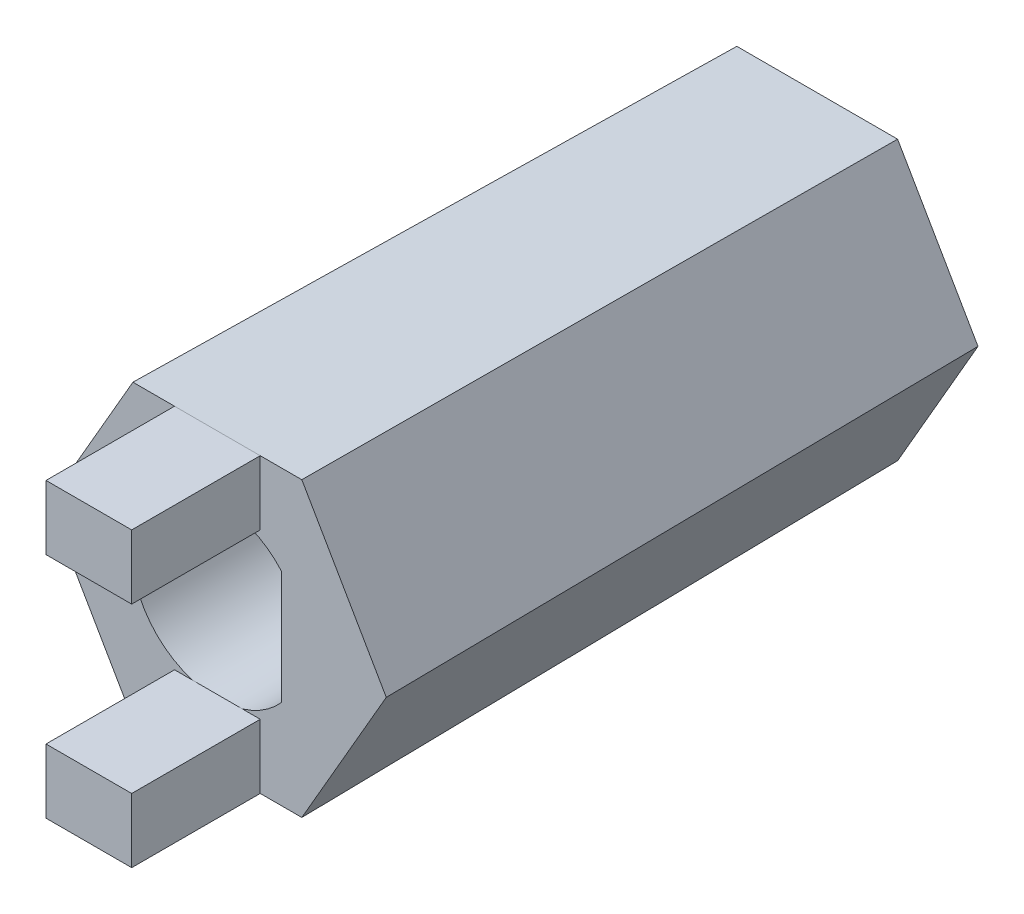
ISO-10303-21;
HEADER;
FILE_DESCRIPTION(('STEP AP214'),'2;1');
FILE_NAME('part.step','',(''),(''),'','','');
FILE_SCHEMA(('AUTOMOTIVE_DESIGN { 1 0 10303 214 1 1 1 1 }'));
ENDSEC;
DATA;
#1=APPLICATION_CONTEXT('core data for automotive mechanical design processes');
#2=APPLICATION_PROTOCOL_DEFINITION('international standard','automotive_design',2000,#1);
#3=PRODUCT_CONTEXT('',#1,'mechanical');
#4=PRODUCT('Part','Part','',(#3));
#5=PRODUCT_RELATED_PRODUCT_CATEGORY('part','',(#4));
#6=PRODUCT_DEFINITION_FORMATION('','',#4);
#7=PRODUCT_DEFINITION_CONTEXT('part definition',#1,'design');
#8=PRODUCT_DEFINITION('design','',#6,#7);
#9=PRODUCT_DEFINITION_SHAPE('','',#8);
#10=(LENGTH_UNIT() NAMED_UNIT(*) SI_UNIT(.MILLI.,.METRE.));
#11=(NAMED_UNIT(*) PLANE_ANGLE_UNIT() SI_UNIT($,.RADIAN.));
#12=(NAMED_UNIT(*) SI_UNIT($,.STERADIAN.) SOLID_ANGLE_UNIT());
#13=UNCERTAINTY_MEASURE_WITH_UNIT(LENGTH_MEASURE(1.E-05),#10,'distance_accuracy_value','');
#14=(GEOMETRIC_REPRESENTATION_CONTEXT(3) GLOBAL_UNCERTAINTY_ASSIGNED_CONTEXT((#13)) GLOBAL_UNIT_ASSIGNED_CONTEXT((#10,
#11,#12)) REPRESENTATION_CONTEXT('',''));
#15=CARTESIAN_POINT('',(0.,0.,0.));
#16=DIRECTION('',(0.,0.,1.));
#17=DIRECTION('',(1.,0.,0.));
#18=AXIS2_PLACEMENT_3D('',#15,#16,#17);
#19=CARTESIAN_POINT('',(0.,0.,14.));
#20=DIRECTION('',(0.,0.,1.));
#21=DIRECTION('',(1.,0.,0.));
#22=AXIS2_PLACEMENT_3D('',#19,#20,#21);
#23=PLANE('',#22);
#24=DIRECTION('',(-1.,0.,0.));
#25=VECTOR('',#24,1.);
#26=CARTESIAN_POINT('',(1.,-1.91371934638351,14.));
#27=LINE('',#26,#25);
#28=CARTESIAN_POINT('',(1.,-1.91371934638351,14.));
#29=VERTEX_POINT('',#28);
#30=CARTESIAN_POINT('',(0.581100906278292,-1.91371934638351,14.));
#31=VERTEX_POINT('',#30);
#32=EDGE_CURVE('E54',#29,#31,#27,.T.);
#33=ORIENTED_EDGE('',*,*,#32,.F.);
#34=DIRECTION('',(0.,1.,0.));
#35=VECTOR('',#34,1.);
#36=CARTESIAN_POINT('',(1.,-1.91371934638351,14.));
#37=LINE('',#36,#35);
#38=CARTESIAN_POINT('',(1.,-3.41371934638351,14.));
#39=VERTEX_POINT('',#38);
#40=EDGE_CURVE('E186',#39,#29,#37,.T.);
#41=ORIENTED_EDGE('',*,*,#40,.F.);
#42=DIRECTION('',(-1.,0.,0.));
#43=VECTOR('',#42,1.);
#44=CARTESIAN_POINT('',(-1.87638837486628,-3.41371934638352,14.));
#45=LINE('',#44,#43);
#46=CARTESIAN_POINT('',(1.97091178357236,-3.41371934638351,14.));
#47=VERTEX_POINT('',#46);
#48=EDGE_CURVE('E334',#39,#47,#45,.F.);
#49=ORIENTED_EDGE('',*,*,#48,.T.);
#50=DIRECTION('',(-0.5,-0.866025403784439,0.));
#51=VECTOR('',#50,1.);
#52=CARTESIAN_POINT('',(2.01817348792539,-3.33185967319176,14.));
#53=LINE('',#52,#51);
#54=CARTESIAN_POINT('',(3.94182356714471,0.,14.));
#55=VERTEX_POINT('',#54);
#56=EDGE_CURVE('E39',#47,#55,#53,.F.);
#57=ORIENTED_EDGE('',*,*,#56,.T.);
#58=DIRECTION('',(0.5,-0.866025403784438,0.));
#59=VECTOR('',#58,1.);
#60=CARTESIAN_POINT('',(3.89456186279168,0.081859673191758,14.));
#61=LINE('',#60,#59);
#62=CARTESIAN_POINT('',(1.97091178357236,3.41371934638351,14.));
#63=VERTEX_POINT('',#62);
#64=EDGE_CURVE('E315',#55,#63,#61,.F.);
#65=ORIENTED_EDGE('',*,*,#64,.T.);
#66=DIRECTION('',(1.,0.,0.));
#67=VECTOR('',#66,1.);
#68=CARTESIAN_POINT('',(1.87638837486628,3.41371934638351,14.));
#69=LINE('',#68,#67);
#70=CARTESIAN_POINT('',(1.,3.41371934638351,14.));
#71=VERTEX_POINT('',#70);
#72=EDGE_CURVE('E329',#63,#71,#69,.F.);
#73=ORIENTED_EDGE('',*,*,#72,.T.);
#74=DIRECTION('',(0.,1.,0.));
#75=VECTOR('',#74,1.);
#76=CARTESIAN_POINT('',(1.,1.91371934638351,14.));
#77=LINE('',#76,#75);
#78=CARTESIAN_POINT('',(1.,1.91371934638351,14.));
#79=VERTEX_POINT('',#78);
#80=EDGE_CURVE('E206',#79,#71,#77,.T.);
#81=ORIENTED_EDGE('',*,*,#80,.F.);
#82=DIRECTION('',(1.,0.,0.));
#83=VECTOR('',#82,1.);
#84=CARTESIAN_POINT('',(1.,1.91371934638351,14.));
#85=LINE('',#84,#83);
#86=CARTESIAN_POINT('',(0.581100906278292,1.91371934638351,14.));
#87=VERTEX_POINT('',#86);
#88=EDGE_CURVE('E11',#87,#79,#85,.T.);
#89=ORIENTED_EDGE('',*,*,#88,.F.);
#90=CARTESIAN_POINT('',(0.,0.,14.));
#91=DIRECTION('',(0.,0.,1.));
#92=DIRECTION('',(1.,0.,0.));
#93=AXIS2_PLACEMENT_3D('',#90,#91,#92);
#94=CIRCLE('',#93,2.);
#95=CARTESIAN_POINT('',(1.5,1.3228756555323,14.));
#96=VERTEX_POINT('',#95);
#97=EDGE_CURVE('E225',#96,#87,#94,.T.);
#98=ORIENTED_EDGE('',*,*,#97,.F.);
#99=DIRECTION('',(0.,-1.,0.));
#100=VECTOR('',#99,1.);
#101=CARTESIAN_POINT('',(1.5,0.,14.));
#102=LINE('',#101,#100);
#103=CARTESIAN_POINT('',(1.5,-1.3228756555323,14.));
#104=VERTEX_POINT('',#103);
#105=EDGE_CURVE('E221',#96,#104,#102,.T.);
#106=ORIENTED_EDGE('',*,*,#105,.T.);
#107=EDGE_CURVE('E224',#31,#104,#94,.T.);
#108=ORIENTED_EDGE('',*,*,#107,.F.);
#109=EDGE_LOOP('',(#33,#41,#49,#57,#65,#73,#81,#89,#98,#106,#108));
#110=FACE_BOUND('',#109,.T.);
#111=ADVANCED_FACE('F35',(#110),#23,.T.);
#112=DIRECTION('',(0.,-1.,0.));
#113=VECTOR('',#112,1.);
#114=CARTESIAN_POINT('',(-1.,-1.91371934638351,14.));
#115=LINE('',#114,#113);
#116=CARTESIAN_POINT('',(-1.,-1.91371934638351,14.));
#117=VERTEX_POINT('',#116);
#118=CARTESIAN_POINT('',(-1.,-3.41371934638351,14.));
#119=VERTEX_POINT('',#118);
#120=EDGE_CURVE('E566',#117,#119,#115,.T.);
#121=ORIENTED_EDGE('',*,*,#120,.F.);
#122=CARTESIAN_POINT('',(-0.581100906278293,-1.91371934638351,14.));
#123=VERTEX_POINT('',#122);
#124=EDGE_CURVE('E564',#123,#117,#27,.T.);
#125=ORIENTED_EDGE('',*,*,#124,.F.);
#126=CARTESIAN_POINT('',(-0.581100906278293,1.91371934638351,14.));
#127=VERTEX_POINT('',#126);
#128=EDGE_CURVE('E372',#127,#123,#94,.T.);
#129=ORIENTED_EDGE('',*,*,#128,.F.);
#130=CARTESIAN_POINT('',(-1.,1.91371934638351,14.));
#131=VERTEX_POINT('',#130);
#132=EDGE_CURVE('E46',#131,#127,#85,.T.);
#133=ORIENTED_EDGE('',*,*,#132,.F.);
#134=DIRECTION('',(0.,-1.,0.));
#135=VECTOR('',#134,1.);
#136=CARTESIAN_POINT('',(-1.,1.91371934638351,14.));
#137=LINE('',#136,#135);
#138=CARTESIAN_POINT('',(-0.999999999999999,3.41371934638351,14.));
#139=VERTEX_POINT('',#138);
#140=EDGE_CURVE('E187',#139,#131,#137,.T.);
#141=ORIENTED_EDGE('',*,*,#140,.F.);
#142=CARTESIAN_POINT('',(-1.97091178357236,3.41371934638351,14.));
#143=VERTEX_POINT('',#142);
#144=EDGE_CURVE('E328',#139,#143,#69,.F.);
#145=ORIENTED_EDGE('',*,*,#144,.T.);
#146=DIRECTION('',(0.5,0.866025403784439,0.));
#147=VECTOR('',#146,1.);
#148=CARTESIAN_POINT('',(-2.01817348792539,3.33185967319176,14.));
#149=LINE('',#148,#147);
#150=CARTESIAN_POINT('',(-3.94182356714471,0.,14.));
#151=VERTEX_POINT('',#150);
#152=EDGE_CURVE('E332',#143,#151,#149,.F.);
#153=ORIENTED_EDGE('',*,*,#152,.T.);
#154=DIRECTION('',(-0.5,0.866025403784438,0.));
#155=VECTOR('',#154,1.);
#156=CARTESIAN_POINT('',(-3.89456186279167,-0.0818596731917588,14.));
#157=LINE('',#156,#155);
#158=CARTESIAN_POINT('',(-1.97091178357235,-3.41371934638352,14.));
#159=VERTEX_POINT('',#158);
#160=EDGE_CURVE('E302',#151,#159,#157,.F.);
#161=ORIENTED_EDGE('',*,*,#160,.T.);
#162=EDGE_CURVE('E335',#159,#119,#45,.F.);
#163=ORIENTED_EDGE('',*,*,#162,.T.);
#164=EDGE_LOOP('',(#121,#125,#129,#133,#141,#145,#153,#161,#163));
#165=FACE_BOUND('',#164,.T.);
#166=ADVANCED_FACE('F258',(#165),#23,.T.);
#167=CARTESIAN_POINT('',(3.75277674973257,0.,0.));
#168=DIRECTION('',(0.865966193107302,0.499965814699617,-0.0116934394852461));
#169=DIRECTION('',(-0.5,0.866025403784438,0.));
#170=AXIS2_PLACEMENT_3D('',#167,#168,#169);
#171=PLANE('',#170);
#172=DIRECTION('',(-0.5,0.866025403784438,0.));
#173=VECTOR('',#172,1.);
#174=CARTESIAN_POINT('',(3.75277674973257,0.,0.));
#175=LINE('',#174,#173);
#176=CARTESIAN_POINT('',(3.75277674973257,0.,0.));
#177=VERTEX_POINT('',#176);
#178=CARTESIAN_POINT('',(1.87638837486628,3.25,0.));
#179=VERTEX_POINT('',#178);
#180=EDGE_CURVE('E239',#177,#179,#175,.T.);
#181=ORIENTED_EDGE('',*,*,#180,.T.);
#182=DIRECTION('',(-0.00675105658364069,-0.011693173007638,-0.999908842315147));
#183=VECTOR('',#182,1.);
#184=CARTESIAN_POINT('',(1.87638837486628,3.25,0.));
#185=LINE('',#184,#183);
#186=EDGE_CURVE('E44',#63,#179,#185,.T.);
#187=ORIENTED_EDGE('',*,*,#186,.F.);
#188=ORIENTED_EDGE('',*,*,#64,.F.);
#189=DIRECTION('',(-0.0135021131672814,0.,-0.999908842315147));
#190=VECTOR('',#189,1.);
#191=CARTESIAN_POINT('',(3.75277674973257,0.,0.));
#192=LINE('',#191,#190);
#193=EDGE_CURVE('E318',#55,#177,#192,.T.);
#194=ORIENTED_EDGE('',*,*,#193,.T.);
#195=EDGE_LOOP('',(#181,#187,#188,#194));
#196=FACE_BOUND('',#195,.T.);
#197=ADVANCED_FACE('F265',(#196),#171,.T.);
#198=CARTESIAN_POINT('',(1.87638837486628,3.25,0.));
#199=DIRECTION('',(0.,0.999931629399233,-0.0116934394852461));
#200=DIRECTION('',(0.,0.0116934394852461,0.999931629399233));
#201=AXIS2_PLACEMENT_3D('',#198,#199,#200);
#202=PLANE('',#201);
#203=DIRECTION('',(-1.,0.,0.));
#204=VECTOR('',#203,1.);
#205=CARTESIAN_POINT('',(1.87638837486628,3.25,0.));
#206=LINE('',#205,#204);
#207=CARTESIAN_POINT('',(-1.87638837486628,3.25,0.));
#208=VERTEX_POINT('',#207);
#209=EDGE_CURVE('E298',#179,#208,#206,.T.);
#210=ORIENTED_EDGE('',*,*,#209,.T.);
#211=DIRECTION('',(0.0067510565836407,-0.011693173007638,-0.999908842315147));
#212=VECTOR('',#211,1.);
#213=CARTESIAN_POINT('',(-1.87638837486628,3.25,0.));
#214=LINE('',#213,#212);
#215=EDGE_CURVE('E295',#143,#208,#214,.T.);
#216=ORIENTED_EDGE('',*,*,#215,.F.);
#217=ORIENTED_EDGE('',*,*,#144,.F.);
#218=DIRECTION('',(-1.,0.,0.));
#219=VECTOR('',#218,1.);
#220=CARTESIAN_POINT('',(1.,3.41371934638351,14.));
#221=LINE('',#220,#219);
#222=EDGE_CURVE('E199',#71,#139,#221,.T.);
#223=ORIENTED_EDGE('',*,*,#222,.F.);
#224=ORIENTED_EDGE('',*,*,#72,.F.);
#225=ORIENTED_EDGE('',*,*,#186,.T.);
#226=EDGE_LOOP('',(#210,#216,#217,#223,#224,#225));
#227=FACE_BOUND('',#226,.T.);
#228=ADVANCED_FACE('F37',(#227),#202,.T.);
#229=CARTESIAN_POINT('',(-1.87638837486628,3.25,0.));
#230=DIRECTION('',(-0.865966193107303,0.499965814699616,-0.0116934394852461));
#231=DIRECTION('',(-0.5,-0.866025403784439,0.));
#232=AXIS2_PLACEMENT_3D('',#229,#230,#231);
#233=PLANE('',#232);
#234=DIRECTION('',(-0.5,-0.866025403784439,0.));
#235=VECTOR('',#234,1.);
#236=CARTESIAN_POINT('',(-1.87638837486628,3.25,0.));
#237=LINE('',#236,#235);
#238=CARTESIAN_POINT('',(-3.75277674973257,0.,0.));
#239=VERTEX_POINT('',#238);
#240=EDGE_CURVE('E289',#208,#239,#237,.T.);
#241=ORIENTED_EDGE('',*,*,#240,.T.);
#242=DIRECTION('',(0.0135021131672814,0.,-0.999908842315147));
#243=VECTOR('',#242,1.);
#244=CARTESIAN_POINT('',(-3.75277674973257,0.,0.));
#245=LINE('',#244,#243);
#246=EDGE_CURVE('E292',#151,#239,#245,.T.);
#247=ORIENTED_EDGE('',*,*,#246,.F.);
#248=ORIENTED_EDGE('',*,*,#152,.F.);
#249=ORIENTED_EDGE('',*,*,#215,.T.);
#250=EDGE_LOOP('',(#241,#247,#248,#249));
#251=FACE_BOUND('',#250,.T.);
#252=ADVANCED_FACE('F278',(#251),#233,.T.);
#253=CARTESIAN_POINT('',(-3.75277674973257,0.,0.));
#254=DIRECTION('',(-0.865966193107302,-0.499965814699617,-0.0116934394852461));
#255=DIRECTION('',(0.5,-0.866025403784438,0.));
#256=AXIS2_PLACEMENT_3D('',#253,#254,#255);
#257=PLANE('',#256);
#258=DIRECTION('',(0.5,-0.866025403784439,0.));
#259=VECTOR('',#258,1.);
#260=CARTESIAN_POINT('',(-3.75277674973257,0.,0.));
#261=LINE('',#260,#259);
#262=CARTESIAN_POINT('',(-1.87638837486628,-3.25,0.));
#263=VERTEX_POINT('',#262);
#264=EDGE_CURVE('E297',#239,#263,#261,.T.);
#265=ORIENTED_EDGE('',*,*,#264,.T.);
#266=DIRECTION('',(0.00675105658364069,0.0116931730076381,-0.999908842315147));
#267=VECTOR('',#266,1.);
#268=CARTESIAN_POINT('',(-1.87638837486628,-3.25,0.));
#269=LINE('',#268,#267);
#270=EDGE_CURVE('E303',#159,#263,#269,.T.);
#271=ORIENTED_EDGE('',*,*,#270,.F.);
#272=ORIENTED_EDGE('',*,*,#160,.F.);
#273=ORIENTED_EDGE('',*,*,#246,.T.);
#274=EDGE_LOOP('',(#265,#271,#272,#273));
#275=FACE_BOUND('',#274,.T.);
#276=ADVANCED_FACE('F275',(#275),#257,.T.);
#277=CARTESIAN_POINT('',(-1.87638837486628,-3.25,0.));
#278=DIRECTION('',(0.,-0.999931629399233,-0.0116934394852461));
#279=DIRECTION('',(0.,0.0116934394852461,-0.999931629399233));
#280=AXIS2_PLACEMENT_3D('',#277,#278,#279);
#281=PLANE('',#280);
#282=DIRECTION('',(1.,0.,0.));
#283=VECTOR('',#282,1.);
#284=CARTESIAN_POINT('',(-1.87638837486628,-3.25,0.));
#285=LINE('',#284,#283);
#286=CARTESIAN_POINT('',(1.87638837486629,-3.25,0.));
#287=VERTEX_POINT('',#286);
#288=EDGE_CURVE('E308',#263,#287,#285,.T.);
#289=ORIENTED_EDGE('',*,*,#288,.T.);
#290=DIRECTION('',(-0.00675105658364069,0.011693173007638,-0.999908842315147));
#291=VECTOR('',#290,1.);
#292=CARTESIAN_POINT('',(1.87638837486629,-3.25,0.));
#293=LINE('',#292,#291);
#294=EDGE_CURVE('E321',#47,#287,#293,.T.);
#295=ORIENTED_EDGE('',*,*,#294,.F.);
#296=ORIENTED_EDGE('',*,*,#48,.F.);
#297=DIRECTION('',(1.,0.,0.));
#298=VECTOR('',#297,1.);
#299=CARTESIAN_POINT('',(1.,-3.41371934638351,14.));
#300=LINE('',#299,#298);
#301=EDGE_CURVE('E182',#119,#39,#300,.T.);
#302=ORIENTED_EDGE('',*,*,#301,.F.);
#303=ORIENTED_EDGE('',*,*,#162,.F.);
#304=ORIENTED_EDGE('',*,*,#270,.T.);
#305=EDGE_LOOP('',(#289,#295,#296,#302,#303,#304));
#306=FACE_BOUND('',#305,.T.);
#307=ADVANCED_FACE('F271',(#306),#281,.T.);
#308=CARTESIAN_POINT('',(1.87638837486629,-3.25,0.));
#309=DIRECTION('',(0.865966193107303,-0.499965814699616,-0.0116934394852461));
#310=DIRECTION('',(0.5,0.866025403784439,0.));
#311=AXIS2_PLACEMENT_3D('',#308,#309,#310);
#312=PLANE('',#311);
#313=DIRECTION('',(0.5,0.866025403784439,0.));
#314=VECTOR('',#313,1.);
#315=CARTESIAN_POINT('',(1.87638837486629,-3.25,0.));
#316=LINE('',#315,#314);
#317=EDGE_CURVE('E310',#287,#177,#316,.T.);
#318=ORIENTED_EDGE('',*,*,#317,.T.);
#319=ORIENTED_EDGE('',*,*,#193,.F.);
#320=ORIENTED_EDGE('',*,*,#56,.F.);
#321=ORIENTED_EDGE('',*,*,#294,.T.);
#322=EDGE_LOOP('',(#318,#319,#320,#321));
#323=FACE_BOUND('',#322,.T.);
#324=ADVANCED_FACE('F263',(#323),#312,.T.);
#325=CARTESIAN_POINT('',(0.,0.,0.));
#326=DIRECTION('',(0.,0.,1.));
#327=DIRECTION('',(1.,0.,0.));
#328=AXIS2_PLACEMENT_3D('',#325,#326,#327);
#329=PLANE('',#328);
#330=ORIENTED_EDGE('',*,*,#180,.F.);
#331=ORIENTED_EDGE('',*,*,#317,.F.);
#332=ORIENTED_EDGE('',*,*,#288,.F.);
#333=ORIENTED_EDGE('',*,*,#264,.F.);
#334=ORIENTED_EDGE('',*,*,#240,.F.);
#335=ORIENTED_EDGE('',*,*,#209,.F.);
#336=EDGE_LOOP('',(#330,#331,#332,#333,#334,#335));
#337=FACE_BOUND('',#336,.T.);
#338=ADVANCED_FACE('F260',(#337),#329,.F.);
#339=CARTESIAN_POINT('',(1.5,0.,14.));
#340=DIRECTION('',(0.999931629399233,0.,-0.0116934394852461));
#341=DIRECTION('',(-0.0116934394852461,0.,-0.999931629399233));
#342=AXIS2_PLACEMENT_3D('',#339,#340,#341);
#343=PLANE('',#342);
#344=ORIENTED_EDGE('',*,*,#105,.F.);
#345=CARTESIAN_POINT('',(1.41814032680824,1.29156506874731,7.));
#346=CARTESIAN_POINT('',(1.43292044843653,1.29728596567894,8.26388058202507));
#347=CARTESIAN_POINT('',(1.44770057197983,1.3029702286564,9.52776132780759));
#348=CARTESIAN_POINT('',(1.47498713025429,1.31339668673287,11.8610947076487));
#349=CARTESIAN_POINT('',(1.48749356444157,1.31814928601708,12.9305472951995));
#350=CARTESIAN_POINT('',(1.5,1.3228756555323,14.));
#351=B_SPLINE_CURVE_WITH_KNOTS('',3,(#345,#346,#347,#348,#349,#350),.UNSPECIFIED.,.F.,.F.,(4,2,
4),(0.,3.79193983629961,7.00054864948276),.UNSPECIFIED.);
#352=CARTESIAN_POINT('',(1.41814032680824,1.29156506874731,7.));
#353=VERTEX_POINT('',#352);
#354=EDGE_CURVE('E240',#353,#96,#351,.T.);
#355=ORIENTED_EDGE('',*,*,#354,.F.);
#356=DIRECTION('',(0.,1.,0.));
#357=VECTOR('',#356,1.);
#358=CARTESIAN_POINT('',(1.41814032680824,0.,7.));
#359=LINE('',#358,#357);
#360=CARTESIAN_POINT('',(1.41814032680824,-1.29156506874731,7.));
#361=VERTEX_POINT('',#360);
#362=EDGE_CURVE('E228',#353,#361,#359,.F.);
#363=ORIENTED_EDGE('',*,*,#362,.T.);
#364=CARTESIAN_POINT('',(1.41814032680824,-1.29156506874731,7.));
#365=CARTESIAN_POINT('',(1.43292044843653,-1.29728596567894,8.26388058202507));
#366=CARTESIAN_POINT('',(1.44770057197983,-1.3029702286564,9.52776132780759));
#367=CARTESIAN_POINT('',(1.47498713025429,-1.31339668673287,11.8610947076487));
#368=CARTESIAN_POINT('',(1.48749356444157,-1.31814928601708,12.9305472951995));
#369=CARTESIAN_POINT('',(1.5,-1.3228756555323,14.));
#370=B_SPLINE_CURVE_WITH_KNOTS('',3,(#364,#365,#366,#367,#368,#369),.UNSPECIFIED.,.F.,.F.,(4,2,
4),(0.,3.79193983629961,7.00054864948276),.UNSPECIFIED.);
#371=EDGE_CURVE('E230',#361,#104,#370,.T.);
#372=ORIENTED_EDGE('',*,*,#371,.T.);
#373=EDGE_LOOP('',(#344,#355,#363,#372));
#374=FACE_BOUND('',#373,.T.);
#375=ADVANCED_FACE('F246',(#374),#343,.F.);
#376=CARTESIAN_POINT('',(0.,0.,14.));
#377=DIRECTION('',(0.,0.,1.));
#378=DIRECTION('',(1.,0.,0.));
#379=AXIS2_PLACEMENT_3D('',#376,#377,#378);
#380=CONICAL_SURFACE('',#379,2.,0.011693705988362);
#381=ORIENTED_EDGE('',*,*,#97,.T.);
#382=EDGE_CURVE('E229',#87,#127,#94,.T.);
#383=ORIENTED_EDGE('',*,*,#382,.T.);
#384=ORIENTED_EDGE('',*,*,#128,.T.);
#385=EDGE_CURVE('E373',#123,#31,#94,.T.);
#386=ORIENTED_EDGE('',*,*,#385,.T.);
#387=ORIENTED_EDGE('',*,*,#107,.T.);
#388=ORIENTED_EDGE('',*,*,#371,.F.);
#389=CARTESIAN_POINT('',(0.,0.,7.));
#390=DIRECTION('',(0.,0.,1.));
#391=DIRECTION('',(1.,0.,0.));
#392=AXIS2_PLACEMENT_3D('',#389,#390,#391);
#393=CIRCLE('',#392,1.91814032680824);
#394=EDGE_CURVE('E381',#353,#361,#393,.T.);
#395=ORIENTED_EDGE('',*,*,#394,.F.);
#396=ORIENTED_EDGE('',*,*,#354,.T.);
#397=EDGE_LOOP('',(#381,#383,#384,#386,#387,#388,#395,#396));
#398=FACE_BOUND('',#397,.T.);
#399=ADVANCED_FACE('F249',(#398),#380,.F.);
#400=CARTESIAN_POINT('',(0.,0.,7.));
#401=DIRECTION('',(0.,0.,1.));
#402=DIRECTION('',(1.,0.,0.));
#403=AXIS2_PLACEMENT_3D('',#400,#401,#402);
#404=PLANE('',#403);
#405=ORIENTED_EDGE('',*,*,#362,.F.);
#406=ORIENTED_EDGE('',*,*,#394,.T.);
#407=EDGE_LOOP('',(#405,#406));
#408=FACE_BOUND('',#407,.T.);
#409=ADVANCED_FACE('F253',(#408),#404,.T.);
#410=CARTESIAN_POINT('',(-1.,1.91371934638351,17.));
#411=DIRECTION('',(1.,0.,0.));
#412=DIRECTION('',(0.,0.,-1.));
#413=AXIS2_PLACEMENT_3D('',#410,#411,#412);
#414=PLANE('',#413);
#415=ORIENTED_EDGE('',*,*,#140,.T.);
#416=DIRECTION('',(0.,0.,-1.));
#417=VECTOR('',#416,1.);
#418=CARTESIAN_POINT('',(-1.,1.91371934638351,17.));
#419=LINE('',#418,#417);
#420=CARTESIAN_POINT('',(-1.,1.91371934638351,17.));
#421=VERTEX_POINT('',#420);
#422=EDGE_CURVE('E219',#421,#131,#419,.T.);
#423=ORIENTED_EDGE('',*,*,#422,.F.);
#424=DIRECTION('',(0.,-1.,0.));
#425=VECTOR('',#424,1.);
#426=CARTESIAN_POINT('',(-1.,1.91371934638351,17.));
#427=LINE('',#426,#425);
#428=CARTESIAN_POINT('',(-1.,3.41371934638351,17.));
#429=VERTEX_POINT('',#428);
#430=EDGE_CURVE('E195',#429,#421,#427,.T.);
#431=ORIENTED_EDGE('',*,*,#430,.F.);
#432=DIRECTION('',(0.,0.,-1.));
#433=VECTOR('',#432,1.);
#434=CARTESIAN_POINT('',(-1.,3.41371934638351,17.));
#435=LINE('',#434,#433);
#436=EDGE_CURVE('E204',#429,#139,#435,.T.);
#437=ORIENTED_EDGE('',*,*,#436,.T.);
#438=EDGE_LOOP('',(#415,#423,#431,#437));
#439=FACE_BOUND('',#438,.T.);
#440=ADVANCED_FACE('F386',(#439),#414,.F.);
#441=CARTESIAN_POINT('',(1.,1.91371934638351,17.));
#442=DIRECTION('',(0.,1.,0.));
#443=DIRECTION('',(-1.,0.,0.));
#444=AXIS2_PLACEMENT_3D('',#441,#442,#443);
#445=PLANE('',#444);
#446=ORIENTED_EDGE('',*,*,#132,.T.);
#447=EDGE_CURVE('E47',#127,#87,#85,.T.);
#448=ORIENTED_EDGE('',*,*,#447,.T.);
#449=ORIENTED_EDGE('',*,*,#88,.T.);
#450=DIRECTION('',(0.,0.,-1.));
#451=VECTOR('',#450,1.);
#452=CARTESIAN_POINT('',(1.,1.91371934638351,17.));
#453=LINE('',#452,#451);
#454=CARTESIAN_POINT('',(1.,1.91371934638351,17.));
#455=VERTEX_POINT('',#454);
#456=EDGE_CURVE('E216',#455,#79,#453,.T.);
#457=ORIENTED_EDGE('',*,*,#456,.F.);
#458=DIRECTION('',(1.,0.,0.));
#459=VECTOR('',#458,1.);
#460=CARTESIAN_POINT('',(1.,1.91371934638351,17.));
#461=LINE('',#460,#459);
#462=EDGE_CURVE('E198',#421,#455,#461,.T.);
#463=ORIENTED_EDGE('',*,*,#462,.F.);
#464=ORIENTED_EDGE('',*,*,#422,.T.);
#465=EDGE_LOOP('',(#446,#448,#449,#457,#463,#464));
#466=FACE_BOUND('',#465,.T.);
#467=ADVANCED_FACE('F361',(#466),#445,.F.);
#468=CARTESIAN_POINT('',(1.,1.91371934638351,17.));
#469=DIRECTION('',(-1.,0.,0.));
#470=DIRECTION('',(0.,0.,1.));
#471=AXIS2_PLACEMENT_3D('',#468,#469,#470);
#472=PLANE('',#471);
#473=ORIENTED_EDGE('',*,*,#80,.T.);
#474=DIRECTION('',(0.,0.,-1.));
#475=VECTOR('',#474,1.);
#476=CARTESIAN_POINT('',(1.,3.41371934638351,17.));
#477=LINE('',#476,#475);
#478=CARTESIAN_POINT('',(1.,3.41371934638351,17.));
#479=VERTEX_POINT('',#478);
#480=EDGE_CURVE('E213',#479,#71,#477,.T.);
#481=ORIENTED_EDGE('',*,*,#480,.F.);
#482=DIRECTION('',(0.,1.,0.));
#483=VECTOR('',#482,1.);
#484=CARTESIAN_POINT('',(1.,1.91371934638351,17.));
#485=LINE('',#484,#483);
#486=EDGE_CURVE('E201',#455,#479,#485,.T.);
#487=ORIENTED_EDGE('',*,*,#486,.F.);
#488=ORIENTED_EDGE('',*,*,#456,.T.);
#489=EDGE_LOOP('',(#473,#481,#487,#488));
#490=FACE_BOUND('',#489,.T.);
#491=ADVANCED_FACE('F349',(#490),#472,.F.);
#492=CARTESIAN_POINT('',(1.,3.41371934638351,17.));
#493=DIRECTION('',(0.,-1.,0.));
#494=DIRECTION('',(0.,0.,-1.));
#495=AXIS2_PLACEMENT_3D('',#492,#493,#494);
#496=PLANE('',#495);
#497=ORIENTED_EDGE('',*,*,#222,.T.);
#498=ORIENTED_EDGE('',*,*,#436,.F.);
#499=DIRECTION('',(-1.,0.,0.));
#500=VECTOR('',#499,1.);
#501=CARTESIAN_POINT('',(1.,3.41371934638351,17.));
#502=LINE('',#501,#500);
#503=EDGE_CURVE('E203',#479,#429,#502,.T.);
#504=ORIENTED_EDGE('',*,*,#503,.F.);
#505=ORIENTED_EDGE('',*,*,#480,.T.);
#506=EDGE_LOOP('',(#497,#498,#504,#505));
#507=FACE_BOUND('',#506,.T.);
#508=ADVANCED_FACE('F354',(#507),#496,.F.);
#509=CARTESIAN_POINT('',(0.,0.,17.));
#510=DIRECTION('',(0.,0.,1.));
#511=DIRECTION('',(1.,0.,0.));
#512=AXIS2_PLACEMENT_3D('',#509,#510,#511);
#513=PLANE('',#512);
#514=ORIENTED_EDGE('',*,*,#430,.T.);
#515=ORIENTED_EDGE('',*,*,#462,.T.);
#516=ORIENTED_EDGE('',*,*,#486,.T.);
#517=ORIENTED_EDGE('',*,*,#503,.T.);
#518=EDGE_LOOP('',(#514,#515,#516,#517));
#519=FACE_BOUND('',#518,.T.);
#520=ADVANCED_FACE('F358',(#519),#513,.T.);
#521=CARTESIAN_POINT('',(0.,0.,14.));
#522=DIRECTION('',(0.,0.,1.));
#523=DIRECTION('',(1.,0.,0.));
#524=AXIS2_PLACEMENT_3D('',#521,#522,#523);
#525=PLANE('',#524);
#526=ORIENTED_EDGE('',*,*,#382,.F.);
#527=ORIENTED_EDGE('',*,*,#447,.F.);
#528=EDGE_LOOP('',(#526,#527));
#529=FACE_BOUND('',#528,.T.);
#530=ADVANCED_FACE('F371',(#529),#525,.F.);
#531=CARTESIAN_POINT('',(0.,0.,14.));
#532=DIRECTION('',(0.,0.,-1.));
#533=DIRECTION('',(-1.,0.,0.));
#534=AXIS2_PLACEMENT_3D('',#531,#532,#533);
#535=PLANE('',#534);
#536=ORIENTED_EDGE('',*,*,#385,.F.);
#537=EDGE_CURVE('E562',#31,#123,#27,.T.);
#538=ORIENTED_EDGE('',*,*,#537,.F.);
#539=EDGE_LOOP('',(#536,#538));
#540=FACE_BOUND('',#539,.T.);
#541=ADVANCED_FACE('F401',(#540),#535,.T.);
#542=CARTESIAN_POINT('',(1.,-1.91371934638351,17.));
#543=DIRECTION('',(-1.,0.,0.));
#544=DIRECTION('',(0.,0.,1.));
#545=AXIS2_PLACEMENT_3D('',#542,#543,#544);
#546=PLANE('',#545);
#547=ORIENTED_EDGE('',*,*,#40,.T.);
#548=DIRECTION('',(0.,0.,-1.));
#549=VECTOR('',#548,1.);
#550=CARTESIAN_POINT('',(1.,-1.91371934638351,17.));
#551=LINE('',#550,#549);
#552=CARTESIAN_POINT('',(1.,-1.91371934638351,17.));
#553=VERTEX_POINT('',#552);
#554=EDGE_CURVE('E166',#553,#29,#551,.T.);
#555=ORIENTED_EDGE('',*,*,#554,.F.);
#556=DIRECTION('',(0.,1.,0.));
#557=VECTOR('',#556,1.);
#558=CARTESIAN_POINT('',(1.,-1.91371934638351,17.));
#559=LINE('',#558,#557);
#560=CARTESIAN_POINT('',(1.,-3.41371934638351,17.));
#561=VERTEX_POINT('',#560);
#562=EDGE_CURVE('E173',#561,#553,#559,.T.);
#563=ORIENTED_EDGE('',*,*,#562,.F.);
#564=DIRECTION('',(0.,0.,-1.));
#565=VECTOR('',#564,1.);
#566=CARTESIAN_POINT('',(1.,-3.41371934638351,17.));
#567=LINE('',#566,#565);
#568=EDGE_CURVE('E573',#561,#39,#567,.T.);
#569=ORIENTED_EDGE('',*,*,#568,.T.);
#570=EDGE_LOOP('',(#547,#555,#563,#569));
#571=FACE_BOUND('',#570,.T.);
#572=ADVANCED_FACE('F184',(#571),#546,.F.);
#573=CARTESIAN_POINT('',(1.,-1.91371934638351,17.));
#574=DIRECTION('',(0.,-1.,0.));
#575=DIRECTION('',(1.,0.,0.));
#576=AXIS2_PLACEMENT_3D('',#573,#574,#575);
#577=PLANE('',#576);
#578=ORIENTED_EDGE('',*,*,#32,.T.);
#579=ORIENTED_EDGE('',*,*,#537,.T.);
#580=ORIENTED_EDGE('',*,*,#124,.T.);
#581=DIRECTION('',(0.,0.,-1.));
#582=VECTOR('',#581,1.);
#583=CARTESIAN_POINT('',(-1.,-1.91371934638351,17.));
#584=LINE('',#583,#582);
#585=CARTESIAN_POINT('',(-1.,-1.91371934638351,17.));
#586=VERTEX_POINT('',#585);
#587=EDGE_CURVE('E169',#586,#117,#584,.T.);
#588=ORIENTED_EDGE('',*,*,#587,.F.);
#589=DIRECTION('',(-1.,0.,0.));
#590=VECTOR('',#589,1.);
#591=CARTESIAN_POINT('',(1.,-1.91371934638351,17.));
#592=LINE('',#591,#590);
#593=EDGE_CURVE('E162',#553,#586,#592,.T.);
#594=ORIENTED_EDGE('',*,*,#593,.F.);
#595=ORIENTED_EDGE('',*,*,#554,.T.);
#596=EDGE_LOOP('',(#578,#579,#580,#588,#594,#595));
#597=FACE_BOUND('',#596,.T.);
#598=ADVANCED_FACE('F164',(#597),#577,.F.);
#599=CARTESIAN_POINT('',(-1.,-1.91371934638351,17.));
#600=DIRECTION('',(1.,0.,0.));
#601=DIRECTION('',(0.,0.,-1.));
#602=AXIS2_PLACEMENT_3D('',#599,#600,#601);
#603=PLANE('',#602);
#604=ORIENTED_EDGE('',*,*,#120,.T.);
#605=DIRECTION('',(0.,0.,-1.));
#606=VECTOR('',#605,1.);
#607=CARTESIAN_POINT('',(-1.,-3.41371934638351,17.));
#608=LINE('',#607,#606);
#609=CARTESIAN_POINT('',(-1.,-3.41371934638351,17.));
#610=VERTEX_POINT('',#609);
#611=EDGE_CURVE('E191',#610,#119,#608,.T.);
#612=ORIENTED_EDGE('',*,*,#611,.F.);
#613=DIRECTION('',(0.,-1.,0.));
#614=VECTOR('',#613,1.);
#615=CARTESIAN_POINT('',(-1.,-1.91371934638351,17.));
#616=LINE('',#615,#614);
#617=EDGE_CURVE('E172',#586,#610,#616,.T.);
#618=ORIENTED_EDGE('',*,*,#617,.F.);
#619=ORIENTED_EDGE('',*,*,#587,.T.);
#620=EDGE_LOOP('',(#604,#612,#618,#619));
#621=FACE_BOUND('',#620,.T.);
#622=ADVANCED_FACE('F408',(#621),#603,.F.);
#623=CARTESIAN_POINT('',(1.,-3.41371934638351,17.));
#624=DIRECTION('',(0.,1.,0.));
#625=DIRECTION('',(0.,0.,1.));
#626=AXIS2_PLACEMENT_3D('',#623,#624,#625);
#627=PLANE('',#626);
#628=ORIENTED_EDGE('',*,*,#301,.T.);
#629=ORIENTED_EDGE('',*,*,#568,.F.);
#630=DIRECTION('',(1.,0.,0.));
#631=VECTOR('',#630,1.);
#632=CARTESIAN_POINT('',(1.,-3.41371934638351,17.));
#633=LINE('',#632,#631);
#634=EDGE_CURVE('E178',#610,#561,#633,.T.);
#635=ORIENTED_EDGE('',*,*,#634,.F.);
#636=ORIENTED_EDGE('',*,*,#611,.T.);
#637=EDGE_LOOP('',(#628,#629,#635,#636));
#638=FACE_BOUND('',#637,.T.);
#639=ADVANCED_FACE('F411',(#638),#627,.F.);
#640=CARTESIAN_POINT('',(0.,0.,17.));
#641=DIRECTION('',(0.,0.,-1.));
#642=DIRECTION('',(-1.,0.,0.));
#643=AXIS2_PLACEMENT_3D('',#640,#641,#642);
#644=PLANE('',#643);
#645=ORIENTED_EDGE('',*,*,#562,.T.);
#646=ORIENTED_EDGE('',*,*,#593,.T.);
#647=ORIENTED_EDGE('',*,*,#617,.T.);
#648=ORIENTED_EDGE('',*,*,#634,.T.);
#649=EDGE_LOOP('',(#645,#646,#647,#648));
#650=FACE_BOUND('',#649,.T.);
#651=ADVANCED_FACE('F176',(#650),#644,.F.);
#652=CLOSED_SHELL('',(#111,#166,#197,#228,#252,#276,#307,#324,#338,#375,#399,#409,#440,#467,
#491,#508,#520,#530,#541,#572,#598,#622,#639,#651));
#653=MANIFOLD_SOLID_BREP('B2',#652);
#654=ADVANCED_BREP_SHAPE_REPRESENTATION('',(#18,#653),#14);
#655=SHAPE_DEFINITION_REPRESENTATION(#9,#654);
ENDSEC;
END-ISO-10303-21;
